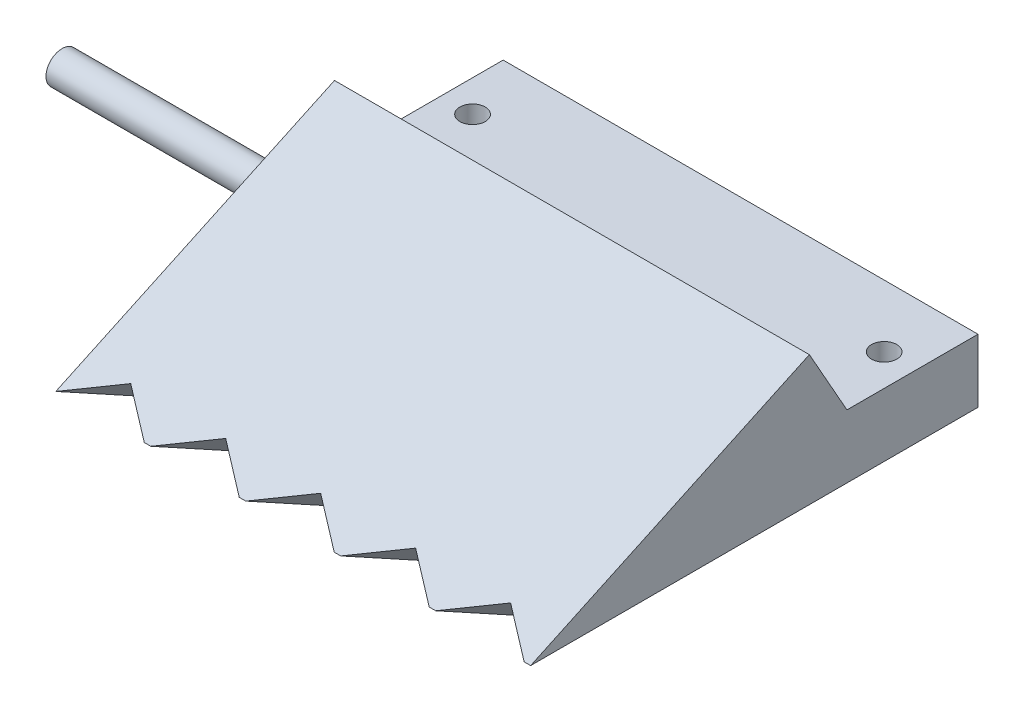
ISO-10303-21;
HEADER;
FILE_DESCRIPTION(('STEP AP214'),'2;1');
FILE_NAME('part.step','',(''),(''),'','','');
FILE_SCHEMA(('AUTOMOTIVE_DESIGN { 1 0 10303 214 1 1 1 1 }'));
ENDSEC;
DATA;
#1=APPLICATION_CONTEXT('core data for automotive mechanical design processes');
#2=APPLICATION_PROTOCOL_DEFINITION('international standard','automotive_design',2000,#1);
#3=PRODUCT_CONTEXT('',#1,'mechanical');
#4=PRODUCT('Part','Part','',(#3));
#5=PRODUCT_RELATED_PRODUCT_CATEGORY('part','',(#4));
#6=PRODUCT_DEFINITION_FORMATION('','',#4);
#7=PRODUCT_DEFINITION_CONTEXT('part definition',#1,'design');
#8=PRODUCT_DEFINITION('design','',#6,#7);
#9=PRODUCT_DEFINITION_SHAPE('','',#8);
#10=(LENGTH_UNIT() NAMED_UNIT(*) SI_UNIT(.MILLI.,.METRE.));
#11=(NAMED_UNIT(*) PLANE_ANGLE_UNIT() SI_UNIT($,.RADIAN.));
#12=(NAMED_UNIT(*) SI_UNIT($,.STERADIAN.) SOLID_ANGLE_UNIT());
#13=UNCERTAINTY_MEASURE_WITH_UNIT(LENGTH_MEASURE(1.E-05),#10,'distance_accuracy_value','');
#14=(GEOMETRIC_REPRESENTATION_CONTEXT(3) GLOBAL_UNCERTAINTY_ASSIGNED_CONTEXT((#13)) GLOBAL_UNIT_ASSIGNED_CONTEXT((#10,
#11,#12)) REPRESENTATION_CONTEXT('',''));
#15=CARTESIAN_POINT('',(0.,0.,0.));
#16=DIRECTION('',(0.,0.,1.));
#17=DIRECTION('',(1.,0.,0.));
#18=AXIS2_PLACEMENT_3D('',#15,#16,#17);
#19=CARTESIAN_POINT('',(75.,24.6994464564003,-8.57109619459907));
#20=DIRECTION('',(0.,-0.906307787036653,-0.422618261740694));
#21=DIRECTION('',(0.,0.422618261740694,-0.906307787036653));
#22=AXIS2_PLACEMENT_3D('',#19,#20,#21);
#23=PLANE('',#22);
#24=DIRECTION('',(0.,-0.422618261740694,0.906307787036653));
#25=VECTOR('',#24,1.);
#26=CARTESIAN_POINT('',(0.,24.6994464564003,-8.57109619459907));
#27=LINE('',#26,#25);
#28=CARTESIAN_POINT('',(0.,24.6994464564003,-8.57109619459907));
#29=VERTEX_POINT('',#28);
#30=CARTESIAN_POINT('',(0.,4.17318887122065,35.4476052489812));
#31=VERTEX_POINT('',#30);
#32=EDGE_CURVE('E220',#29,#31,#27,.T.);
#33=ORIENTED_EDGE('',*,*,#32,.T.);
#34=DIRECTION('',(-0.802159031205732,-0.25234978014748,0.541165849915346));
#35=VECTOR('',#34,1.);
#36=CARTESIAN_POINT('',(0.,4.17318887122065,35.4476052489812));
#37=LINE('',#36,#35);
#38=CARTESIAN_POINT('',(7.06585008190916,6.39602205686052,30.6807240992381));
#39=VERTEX_POINT('',#38);
#40=EDGE_CURVE('E152',#39,#31,#37,.T.);
#41=ORIENTED_EDGE('',*,*,#40,.F.);
#42=DIRECTION('',(-0.795744215045441,0.255951500653194,-0.548889764465591));
#43=VECTOR('',#42,1.);
#44=CARTESIAN_POINT('',(7.06585008190916,6.39602205686052,30.6807240992381));
#45=LINE('',#44,#43);
#46=CARTESIAN_POINT('',(13.9765602905617,4.17318887122065,35.4476052489812));
#47=VERTEX_POINT('',#46);
#48=EDGE_CURVE('E139',#47,#39,#45,.T.);
#49=ORIENTED_EDGE('',*,*,#48,.F.);
#50=DIRECTION('',(-1.,0.,0.));
#51=VECTOR('',#50,1.);
#52=CARTESIAN_POINT('',(75.,4.17318887122065,35.4476052489812));
#53=LINE('',#52,#51);
#54=CARTESIAN_POINT('',(15.,4.17318887122073,35.447605248981));
#55=VERTEX_POINT('',#54);
#56=EDGE_CURVE('E151',#55,#47,#53,.T.);
#57=ORIENTED_EDGE('',*,*,#56,.F.);
#58=DIRECTION('',(-0.802159031205732,-0.252349780147481,0.541165849915346));
#59=VECTOR('',#58,1.);
#60=CARTESIAN_POINT('',(15.,4.17318887122073,35.447605248981));
#61=LINE('',#60,#59);
#62=CARTESIAN_POINT('',(22.0658500819091,6.39602205686061,30.6807240992379));
#63=VERTEX_POINT('',#62);
#64=EDGE_CURVE('E381',#63,#55,#61,.T.);
#65=ORIENTED_EDGE('',*,*,#64,.F.);
#66=DIRECTION('',(-0.795744215045442,0.255951500653195,-0.548889764465591));
#67=VECTOR('',#66,1.);
#68=CARTESIAN_POINT('',(22.0658500819091,6.39602205686061,30.6807240992379));
#69=LINE('',#68,#67);
#70=CARTESIAN_POINT('',(28.9765602905617,4.17318887122073,35.447605248981));
#71=VERTEX_POINT('',#70);
#72=EDGE_CURVE('E204',#71,#63,#69,.T.);
#73=ORIENTED_EDGE('',*,*,#72,.F.);
#74=CARTESIAN_POINT('',(30.,4.17318887122082,35.4476052489808));
#75=VERTEX_POINT('',#74);
#76=EDGE_CURVE('E157',#75,#71,#53,.T.);
#77=ORIENTED_EDGE('',*,*,#76,.F.);
#78=DIRECTION('',(-0.802159031205732,-0.25234978014748,0.541165849915346));
#79=VECTOR('',#78,1.);
#80=CARTESIAN_POINT('',(30.,4.17318887122082,35.4476052489808));
#81=LINE('',#80,#79);
#82=CARTESIAN_POINT('',(37.0658500819091,6.3960220568607,30.6807240992377));
#83=VERTEX_POINT('',#82);
#84=EDGE_CURVE('E193',#83,#75,#81,.T.);
#85=ORIENTED_EDGE('',*,*,#84,.F.);
#86=DIRECTION('',(-0.795744215045442,0.255951500653194,-0.548889764465591));
#87=VECTOR('',#86,1.);
#88=CARTESIAN_POINT('',(37.0658500819091,6.3960220568607,30.6807240992377));
#89=LINE('',#88,#87);
#90=CARTESIAN_POINT('',(43.9765602905617,4.17318887122082,35.4476052489808));
#91=VERTEX_POINT('',#90);
#92=EDGE_CURVE('E191',#91,#83,#89,.T.);
#93=ORIENTED_EDGE('',*,*,#92,.F.);
#94=CARTESIAN_POINT('',(45.,4.17318887122091,35.4476052489806));
#95=VERTEX_POINT('',#94);
#96=EDGE_CURVE('E162',#95,#91,#53,.T.);
#97=ORIENTED_EDGE('',*,*,#96,.F.);
#98=DIRECTION('',(-0.802159031205732,-0.25234978014748,0.541165849915346));
#99=VECTOR('',#98,1.);
#100=CARTESIAN_POINT('',(45.,4.17318887122091,35.4476052489806));
#101=LINE('',#100,#99);
#102=CARTESIAN_POINT('',(52.0658500819091,6.39602205686078,30.6807240992375));
#103=VERTEX_POINT('',#102);
#104=EDGE_CURVE('E188',#103,#95,#101,.T.);
#105=ORIENTED_EDGE('',*,*,#104,.F.);
#106=DIRECTION('',(-0.795744215045442,0.255951500653194,-0.548889764465591));
#107=VECTOR('',#106,1.);
#108=CARTESIAN_POINT('',(52.0658500819091,6.39602205686078,30.6807240992375));
#109=LINE('',#108,#107);
#110=CARTESIAN_POINT('',(58.9765602905616,4.17318887122091,35.4476052489806));
#111=VERTEX_POINT('',#110);
#112=EDGE_CURVE('E205',#111,#103,#109,.T.);
#113=ORIENTED_EDGE('',*,*,#112,.F.);
#114=CARTESIAN_POINT('',(60.,4.173188871221,35.4476052489804));
#115=VERTEX_POINT('',#114);
#116=EDGE_CURVE('E169',#115,#111,#53,.T.);
#117=ORIENTED_EDGE('',*,*,#116,.F.);
#118=DIRECTION('',(-0.802159031205732,-0.25234978014748,0.541165849915346));
#119=VECTOR('',#118,1.);
#120=CARTESIAN_POINT('',(60.,4.173188871221,35.4476052489804));
#121=LINE('',#120,#119);
#122=CARTESIAN_POINT('',(67.0658500819091,6.39602205686087,30.6807240992373));
#123=VERTEX_POINT('',#122);
#124=EDGE_CURVE('E213',#123,#115,#121,.T.);
#125=ORIENTED_EDGE('',*,*,#124,.F.);
#126=DIRECTION('',(-0.795744215045442,0.255951500653194,-0.548889764465591));
#127=VECTOR('',#126,1.);
#128=CARTESIAN_POINT('',(67.0658500819091,6.39602205686087,30.6807240992373));
#129=LINE('',#128,#127);
#130=CARTESIAN_POINT('',(73.9765602905616,4.173188871221,35.4476052489804));
#131=VERTEX_POINT('',#130);
#132=EDGE_CURVE('E210',#131,#123,#129,.T.);
#133=ORIENTED_EDGE('',*,*,#132,.F.);
#134=CARTESIAN_POINT('',(75.,4.17318887122065,35.4476052489812));
#135=VERTEX_POINT('',#134);
#136=EDGE_CURVE('E160',#135,#131,#53,.T.);
#137=ORIENTED_EDGE('',*,*,#136,.F.);
#138=DIRECTION('',(0.,-0.422618261740694,0.906307787036653));
#139=VECTOR('',#138,1.);
#140=CARTESIAN_POINT('',(75.,24.6994464564003,-8.57109619459907));
#141=LINE('',#140,#139);
#142=CARTESIAN_POINT('',(75.,24.6994464564003,-8.57109619459907));
#143=VERTEX_POINT('',#142);
#144=EDGE_CURVE('E224',#143,#135,#141,.T.);
#145=ORIENTED_EDGE('',*,*,#144,.F.);
#146=DIRECTION('',(-1.,0.,0.));
#147=VECTOR('',#146,1.);
#148=CARTESIAN_POINT('',(75.,24.6994464564003,-8.57109619459907));
#149=LINE('',#148,#147);
#150=EDGE_CURVE('E236',#143,#29,#149,.T.);
#151=ORIENTED_EDGE('',*,*,#150,.T.);
#152=EDGE_LOOP('',(#33,#41,#49,#57,#65,#73,#77,#85,#93,#97,#105,#113,#117,#125,#133,#137,#145,#151));
#153=FACE_BOUND('',#152,.T.);
#154=ADVANCED_FACE('F34',(#153),#23,.F.);
#155=CARTESIAN_POINT('',(75.,4.17318887122065,35.4476052489812));
#156=DIRECTION('',(0.,1.,0.));
#157=DIRECTION('',(0.,0.,1.));
#158=AXIS2_PLACEMENT_3D('',#155,#156,#157);
#159=PLANE('',#158);
#160=CARTESIAN_POINT('',(69.9999989548679,4.17318887122065,-25.3862154796132));
#161=DIRECTION('',(0.,1.,0.));
#162=DIRECTION('',(0.,0.,1.));
#163=AXIS2_PLACEMENT_3D('',#160,#161,#162);
#164=CIRCLE('',#163,3.99999999999999);
#165=CARTESIAN_POINT('',(69.9999989548679,4.17318887122065,-21.3862154796132));
#166=VERTEX_POINT('',#165);
#167=EDGE_CURVE('E279',#166,#166,#164,.T.);
#168=ORIENTED_EDGE('',*,*,#167,.T.);
#169=EDGE_LOOP('',(#168));
#170=FACE_BOUND('',#169,.T.);
#171=CARTESIAN_POINT('',(5.,4.17318887122065,-25.3745592722076));
#172=DIRECTION('',(0.,1.,0.));
#173=DIRECTION('',(0.,0.,1.));
#174=AXIS2_PLACEMENT_3D('',#171,#172,#173);
#175=CIRCLE('',#174,3.99999999999999);
#176=CARTESIAN_POINT('',(5.,4.17318887122065,-21.3745592722076));
#177=VERTEX_POINT('',#176);
#178=EDGE_CURVE('E276',#177,#177,#175,.T.);
#179=ORIENTED_EDGE('',*,*,#178,.T.);
#180=EDGE_LOOP('',(#179));
#181=FACE_BOUND('',#180,.T.);
#182=DIRECTION('',(-0.765791701632656,0.,-0.643088695057347));
#183=VECTOR('',#182,1.);
#184=CARTESIAN_POINT('',(49.7629589494673,4.17318887122065,65.4999398006517));
#185=LINE('',#184,#183);
#186=CARTESIAN_POINT('',(7.06585008190916,4.17318887122065,29.6441999619731));
#187=VERTEX_POINT('',#186);
#188=EDGE_CURVE('E136',#47,#187,#185,.T.);
#189=ORIENTED_EDGE('',*,*,#188,.T.);
#190=DIRECTION('',(-0.772763043523777,0.,0.634694634106724));
#191=VECTOR('',#190,1.);
#192=CARTESIAN_POINT('',(44.7872041077098,4.17318887122065,-1.33753653805802));
#193=LINE('',#192,#191);
#194=EDGE_CURVE('E144',#187,#31,#193,.T.);
#195=ORIENTED_EDGE('',*,*,#194,.T.);
#196=DIRECTION('',(0.,0.,-1.));
#197=VECTOR('',#196,1.);
#198=CARTESIAN_POINT('',(0.,4.17318887122065,35.4476052489812));
#199=LINE('',#198,#197);
#200=CARTESIAN_POINT('',(0.,4.17318887122065,-35.2064814814815));
#201=VERTEX_POINT('',#200);
#202=EDGE_CURVE('E238',#31,#201,#199,.T.);
#203=ORIENTED_EDGE('',*,*,#202,.T.);
#204=DIRECTION('',(-1.,0.,0.));
#205=VECTOR('',#204,1.);
#206=CARTESIAN_POINT('',(75.,4.17318887122065,-35.2064814814815));
#207=LINE('',#206,#205);
#208=CARTESIAN_POINT('',(75.,4.17318887122065,-35.2064814814815));
#209=VERTEX_POINT('',#208);
#210=EDGE_CURVE('E158',#209,#201,#207,.T.);
#211=ORIENTED_EDGE('',*,*,#210,.F.);
#212=DIRECTION('',(0.,0.,-1.));
#213=VECTOR('',#212,1.);
#214=CARTESIAN_POINT('',(75.,4.17318887122065,35.4476052489812));
#215=LINE('',#214,#213);
#216=EDGE_CURVE('E227',#135,#209,#215,.T.);
#217=ORIENTED_EDGE('',*,*,#216,.F.);
#218=ORIENTED_EDGE('',*,*,#136,.T.);
#219=DIRECTION('',(-0.765791701632656,0.,-0.643088695057347));
#220=VECTOR('',#219,1.);
#221=CARTESIAN_POINT('',(74.5767431321014,4.17318887122065,35.9516206353298));
#222=LINE('',#221,#220);
#223=CARTESIAN_POINT('',(67.0658500819091,4.17318887122065,29.6441999619722));
#224=VERTEX_POINT('',#223);
#225=EDGE_CURVE('E168',#131,#224,#222,.T.);
#226=ORIENTED_EDGE('',*,*,#225,.T.);
#227=DIRECTION('',(-0.772763043523777,0.,0.634694634106724));
#228=VECTOR('',#227,1.);
#229=CARTESIAN_POINT('',(68.9574408215415,4.17318887122065,28.0905768915728));
#230=LINE('',#229,#228);
#231=EDGE_CURVE('E172',#224,#115,#230,.T.);
#232=ORIENTED_EDGE('',*,*,#231,.T.);
#233=ORIENTED_EDGE('',*,*,#116,.T.);
#234=DIRECTION('',(-0.765791701632656,0.,-0.643088695057347));
#235=VECTOR('',#234,1.);
#236=CARTESIAN_POINT('',(68.3732970864429,4.17318887122065,43.3387004266603));
#237=LINE('',#236,#235);
#238=CARTESIAN_POINT('',(52.0658500819091,4.17318887122065,29.6441999619725));
#239=VERTEX_POINT('',#238);
#240=EDGE_CURVE('E391',#111,#239,#237,.T.);
#241=ORIENTED_EDGE('',*,*,#240,.T.);
#242=DIRECTION('',(-0.772763043523777,0.,0.634694634106724));
#243=VECTOR('',#242,1.);
#244=CARTESIAN_POINT('',(62.9148816430836,4.17318887122065,20.7335485341651));
#245=LINE('',#244,#243);
#246=EDGE_CURVE('E184',#239,#95,#245,.T.);
#247=ORIENTED_EDGE('',*,*,#246,.T.);
#248=ORIENTED_EDGE('',*,*,#96,.T.);
#249=DIRECTION('',(-0.765791701632656,0.,-0.643088695057347));
#250=VECTOR('',#249,1.);
#251=CARTESIAN_POINT('',(62.1698510407844,4.17318887122065,50.7257802179907));
#252=LINE('',#251,#250);
#253=CARTESIAN_POINT('',(37.0658500819091,4.17318887122065,29.6441999619727));
#254=VERTEX_POINT('',#253);
#255=EDGE_CURVE('E182',#91,#254,#252,.T.);
#256=ORIENTED_EDGE('',*,*,#255,.T.);
#257=DIRECTION('',(-0.772763043523777,0.,0.634694634106724));
#258=VECTOR('',#257,1.);
#259=CARTESIAN_POINT('',(56.8723224646257,4.17318887122065,13.3765201767574));
#260=LINE('',#259,#258);
#261=EDGE_CURVE('E385',#254,#75,#260,.T.);
#262=ORIENTED_EDGE('',*,*,#261,.T.);
#263=ORIENTED_EDGE('',*,*,#76,.T.);
#264=DIRECTION('',(-0.765791701632656,0.,-0.643088695057347));
#265=VECTOR('',#264,1.);
#266=CARTESIAN_POINT('',(55.9664049951259,4.17318887122065,58.1128600093212));
#267=LINE('',#266,#265);
#268=CARTESIAN_POINT('',(22.0658500819091,4.17318887122065,29.6441999619729));
#269=VERTEX_POINT('',#268);
#270=EDGE_CURVE('E383',#71,#269,#267,.T.);
#271=ORIENTED_EDGE('',*,*,#270,.T.);
#272=DIRECTION('',(-0.772763043523778,0.,0.634694634106724));
#273=VECTOR('',#272,1.);
#274=CARTESIAN_POINT('',(50.8297632861678,4.17318887122065,6.01949181934968));
#275=LINE('',#274,#273);
#276=EDGE_CURVE('E145',#269,#55,#275,.T.);
#277=ORIENTED_EDGE('',*,*,#276,.T.);
#278=ORIENTED_EDGE('',*,*,#56,.T.);
#279=EDGE_LOOP('',(#189,#195,#203,#211,#217,#218,#226,#232,#233,#241,#247,#248,#256,#262,#263,
#271,#277,#278));
#280=FACE_BOUND('',#279,.T.);
#281=ADVANCED_FACE('F155',(#170,#181,#280),#159,.F.);
#282=CARTESIAN_POINT('',(75.,4.17318887122065,-35.2064814814815));
#283=DIRECTION('',(0.,0.,1.));
#284=DIRECTION('',(1.,0.,0.));
#285=AXIS2_PLACEMENT_3D('',#282,#283,#284);
#286=PLANE('',#285);
#287=DIRECTION('',(0.,1.,0.));
#288=VECTOR('',#287,1.);
#289=CARTESIAN_POINT('',(0.,4.17318887122065,-35.2064814814815));
#290=LINE('',#289,#288);
#291=CARTESIAN_POINT('',(0.,14.1731888712206,-35.2064814814815));
#292=VERTEX_POINT('',#291);
#293=EDGE_CURVE('E240',#201,#292,#290,.T.);
#294=ORIENTED_EDGE('',*,*,#293,.T.);
#295=DIRECTION('',(-1.,0.,0.));
#296=VECTOR('',#295,1.);
#297=CARTESIAN_POINT('',(75.,14.1731888712206,-35.2064814814815));
#298=LINE('',#297,#296);
#299=CARTESIAN_POINT('',(75.,14.1731888712206,-35.2064814814815));
#300=VERTEX_POINT('',#299);
#301=EDGE_CURVE('E164',#300,#292,#298,.T.);
#302=ORIENTED_EDGE('',*,*,#301,.F.);
#303=DIRECTION('',(0.,1.,0.));
#304=VECTOR('',#303,1.);
#305=CARTESIAN_POINT('',(75.,4.17318887122065,-35.2064814814815));
#306=LINE('',#305,#304);
#307=EDGE_CURVE('E230',#209,#300,#306,.T.);
#308=ORIENTED_EDGE('',*,*,#307,.F.);
#309=ORIENTED_EDGE('',*,*,#210,.T.);
#310=EDGE_LOOP('',(#294,#302,#308,#309));
#311=FACE_BOUND('',#310,.T.);
#312=ADVANCED_FACE('F274',(#311),#286,.F.);
#313=CARTESIAN_POINT('',(75.,14.1731888712206,-35.2064814814815));
#314=DIRECTION('',(0.,-1.,0.));
#315=DIRECTION('',(0.,0.,-1.));
#316=AXIS2_PLACEMENT_3D('',#313,#314,#315);
#317=PLANE('',#316);
#318=CARTESIAN_POINT('',(5.,14.1731888712206,-25.3745592722076));
#319=DIRECTION('',(0.,1.,0.));
#320=DIRECTION('',(0.,0.,1.));
#321=AXIS2_PLACEMENT_3D('',#318,#319,#320);
#322=CIRCLE('',#321,2.);
#323=CARTESIAN_POINT('',(5.,14.1731888712206,-23.3745592722076));
#324=VERTEX_POINT('',#323);
#325=EDGE_CURVE('E217',#324,#324,#322,.T.);
#326=ORIENTED_EDGE('',*,*,#325,.F.);
#327=EDGE_LOOP('',(#326));
#328=FACE_BOUND('',#327,.T.);
#329=CARTESIAN_POINT('',(69.9999989548679,14.1731888712206,-25.3862154796132));
#330=DIRECTION('',(0.,1.,0.));
#331=DIRECTION('',(0.,0.,1.));
#332=AXIS2_PLACEMENT_3D('',#329,#330,#331);
#333=CIRCLE('',#332,2.);
#334=CARTESIAN_POINT('',(69.9999989548679,14.1731888712206,-23.3862154796132));
#335=VERTEX_POINT('',#334);
#336=EDGE_CURVE('E221',#335,#335,#333,.T.);
#337=ORIENTED_EDGE('',*,*,#336,.F.);
#338=EDGE_LOOP('',(#337));
#339=FACE_BOUND('',#338,.T.);
#340=DIRECTION('',(0.,0.,1.));
#341=VECTOR('',#340,1.);
#342=CARTESIAN_POINT('',(0.,14.1731888712206,-35.2064814814815));
#343=LINE('',#342,#341);
#344=CARTESIAN_POINT('',(0.,14.1731888712206,-14.5119108644451));
#345=VERTEX_POINT('',#344);
#346=EDGE_CURVE('E242',#292,#345,#343,.T.);
#347=ORIENTED_EDGE('',*,*,#346,.T.);
#348=DIRECTION('',(-1.,0.,0.));
#349=VECTOR('',#348,1.);
#350=CARTESIAN_POINT('',(75.,14.1731888712206,-14.5119108644451));
#351=LINE('',#350,#349);
#352=CARTESIAN_POINT('',(75.,14.1731888712206,-14.5119108644451));
#353=VERTEX_POINT('',#352);
#354=EDGE_CURVE('E247',#353,#345,#351,.T.);
#355=ORIENTED_EDGE('',*,*,#354,.F.);
#356=DIRECTION('',(0.,0.,1.));
#357=VECTOR('',#356,1.);
#358=CARTESIAN_POINT('',(75.,14.1731888712206,-35.2064814814815));
#359=LINE('',#358,#357);
#360=EDGE_CURVE('E232',#300,#353,#359,.T.);
#361=ORIENTED_EDGE('',*,*,#360,.F.);
#362=ORIENTED_EDGE('',*,*,#301,.T.);
#363=EDGE_LOOP('',(#347,#355,#361,#362));
#364=FACE_BOUND('',#363,.T.);
#365=ADVANCED_FACE('F255',(#328,#339,#364),#317,.F.);
#366=CARTESIAN_POINT('',(75.,14.1731888712206,-14.5119108644451));
#367=DIRECTION('',(0.,-0.491504803469351,0.870874863666735));
#368=DIRECTION('',(0.,-0.870874863666736,-0.491504803469351));
#369=AXIS2_PLACEMENT_3D('',#366,#367,#368);
#370=PLANE('',#369);
#371=DIRECTION('',(0.,0.870874863666735,0.491504803469351));
#372=VECTOR('',#371,1.);
#373=CARTESIAN_POINT('',(0.,14.1731888712206,-14.5119108644451));
#374=LINE('',#373,#372);
#375=EDGE_CURVE('E228',#345,#29,#374,.T.);
#376=ORIENTED_EDGE('',*,*,#375,.T.);
#377=ORIENTED_EDGE('',*,*,#150,.F.);
#378=DIRECTION('',(0.,0.870874863666735,0.491504803469351));
#379=VECTOR('',#378,1.);
#380=CARTESIAN_POINT('',(75.,14.1731888712206,-14.5119108644451));
#381=LINE('',#380,#379);
#382=EDGE_CURVE('E234',#353,#143,#381,.T.);
#383=ORIENTED_EDGE('',*,*,#382,.F.);
#384=ORIENTED_EDGE('',*,*,#354,.T.);
#385=EDGE_LOOP('',(#376,#377,#383,#384));
#386=FACE_BOUND('',#385,.T.);
#387=ADVANCED_FACE('F267',(#386),#370,.F.);
#388=CARTESIAN_POINT('',(75.,0.,0.));
#389=DIRECTION('',(-1.,0.,0.));
#390=DIRECTION('',(0.,0.,1.));
#391=AXIS2_PLACEMENT_3D('',#388,#389,#390);
#392=PLANE('',#391);
#393=ORIENTED_EDGE('',*,*,#144,.T.);
#394=ORIENTED_EDGE('',*,*,#216,.T.);
#395=ORIENTED_EDGE('',*,*,#307,.T.);
#396=ORIENTED_EDGE('',*,*,#360,.T.);
#397=ORIENTED_EDGE('',*,*,#382,.T.);
#398=EDGE_LOOP('',(#393,#394,#395,#396,#397));
#399=FACE_BOUND('',#398,.T.);
#400=ADVANCED_FACE('F272',(#399),#392,.F.);
#401=CARTESIAN_POINT('',(0.,0.,0.));
#402=DIRECTION('',(-1.,0.,0.));
#403=DIRECTION('',(0.,0.,1.));
#404=AXIS2_PLACEMENT_3D('',#401,#402,#403);
#405=PLANE('',#404);
#406=CARTESIAN_POINT('',(0.,8.033515634858,-5.54758710562415));
#407=DIRECTION('',(-1.,0.,0.));
#408=DIRECTION('',(0.,0.,1.));
#409=AXIS2_PLACEMENT_3D('',#406,#407,#408);
#410=CIRCLE('',#409,2.54300844368567);
#411=CARTESIAN_POINT('',(0.,8.033515634858,-3.00457866193848));
#412=VERTEX_POINT('',#411);
#413=EDGE_CURVE('E374',#412,#412,#410,.T.);
#414=ORIENTED_EDGE('',*,*,#413,.F.);
#415=EDGE_LOOP('',(#414));
#416=FACE_BOUND('',#415,.T.);
#417=ORIENTED_EDGE('',*,*,#32,.F.);
#418=ORIENTED_EDGE('',*,*,#375,.F.);
#419=ORIENTED_EDGE('',*,*,#346,.F.);
#420=ORIENTED_EDGE('',*,*,#293,.F.);
#421=ORIENTED_EDGE('',*,*,#202,.F.);
#422=EDGE_LOOP('',(#417,#418,#419,#420,#421));
#423=FACE_BOUND('',#422,.T.);
#424=ADVANCED_FACE('F263',(#416,#423),#405,.T.);
#425=CARTESIAN_POINT('',(69.9999989548679,4.17318887122064,-25.3862154796132));
#426=DIRECTION('',(0.,1.,0.));
#427=DIRECTION('',(0.,0.,1.));
#428=AXIS2_PLACEMENT_3D('',#425,#426,#427);
#429=CYLINDRICAL_SURFACE('',#428,2.);
#430=CARTESIAN_POINT('',(69.9999989548679,6.17318887122064,-25.3862154796132));
#431=DIRECTION('',(0.,1.,0.));
#432=DIRECTION('',(0.,0.,1.));
#433=AXIS2_PLACEMENT_3D('',#430,#431,#432);
#434=CIRCLE('',#433,2.);
#435=CARTESIAN_POINT('',(69.9999989548679,6.17318887122064,-23.3862154796132));
#436=VERTEX_POINT('',#435);
#437=EDGE_CURVE('E42',#436,#436,#434,.F.);
#438=ORIENTED_EDGE('',*,*,#437,.T.);
#439=EDGE_LOOP('',(#438));
#440=FACE_BOUND('',#439,.T.);
#441=ORIENTED_EDGE('',*,*,#336,.T.);
#442=EDGE_LOOP('',(#441));
#443=FACE_BOUND('',#442,.T.);
#444=ADVANCED_FACE('F287',(#440,#443),#429,.F.);
#445=CARTESIAN_POINT('',(5.,4.17318887122064,-25.3745592722076));
#446=DIRECTION('',(0.,1.,0.));
#447=DIRECTION('',(0.,0.,1.));
#448=AXIS2_PLACEMENT_3D('',#445,#446,#447);
#449=CYLINDRICAL_SURFACE('',#448,2.);
#450=CARTESIAN_POINT('',(5.,6.17318887122064,-25.3745592722076));
#451=DIRECTION('',(0.,1.,0.));
#452=DIRECTION('',(0.,0.,1.));
#453=AXIS2_PLACEMENT_3D('',#450,#451,#452);
#454=CIRCLE('',#453,2.);
#455=CARTESIAN_POINT('',(5.,6.17318887122064,-23.3745592722076));
#456=VERTEX_POINT('',#455);
#457=EDGE_CURVE('E11',#456,#456,#454,.F.);
#458=ORIENTED_EDGE('',*,*,#457,.T.);
#459=EDGE_LOOP('',(#458));
#460=FACE_BOUND('',#459,.T.);
#461=ORIENTED_EDGE('',*,*,#325,.T.);
#462=EDGE_LOOP('',(#461));
#463=FACE_BOUND('',#462,.T.);
#464=ADVANCED_FACE('F329',(#460,#463),#449,.F.);
#465=CARTESIAN_POINT('',(60.,-4.88988899914553,31.2214226315735));
#466=DIRECTION('',(-0.597110449293161,0.339007055407765,-0.727002976423532));
#467=DIRECTION('',(-0.772763043523777,0.,0.634694634106724));
#468=AXIS2_PLACEMENT_3D('',#465,#466,#467);
#469=PLANE('',#468);
#470=DIRECTION('',(0.,0.906307787036653,0.422618261740694));
#471=VECTOR('',#470,1.);
#472=CARTESIAN_POINT('',(67.0658500819091,-2.66705581350565,26.4545414818304));
#473=LINE('',#472,#471);
#474=EDGE_CURVE('E208',#224,#123,#473,.T.);
#475=ORIENTED_EDGE('',*,*,#474,.T.);
#476=ORIENTED_EDGE('',*,*,#124,.T.);
#477=ORIENTED_EDGE('',*,*,#231,.F.);
#478=EDGE_LOOP('',(#475,#476,#477));
#479=FACE_BOUND('',#478,.T.);
#480=ADVANCED_FACE('F332',(#479),#469,.F.);
#481=CARTESIAN_POINT('',(67.0658500819091,-2.66705581350565,26.4545414818304));
#482=DIRECTION('',(0.605632846055854,0.336296036952717,-0.721189178585052));
#483=DIRECTION('',(-0.765791701632656,0.,-0.643088695057347));
#484=AXIS2_PLACEMENT_3D('',#481,#482,#483);
#485=PLANE('',#484);
#486=ORIENTED_EDGE('',*,*,#132,.T.);
#487=ORIENTED_EDGE('',*,*,#474,.F.);
#488=ORIENTED_EDGE('',*,*,#225,.F.);
#489=EDGE_LOOP('',(#486,#487,#488));
#490=FACE_BOUND('',#489,.T.);
#491=ADVANCED_FACE('F334',(#490),#485,.F.);
#492=CARTESIAN_POINT('',(45.,-4.88988899914562,31.2214226315737));
#493=DIRECTION('',(-0.597110449293161,0.339007055407765,-0.727002976423532));
#494=DIRECTION('',(-0.772763043523777,0.,0.634694634106724));
#495=AXIS2_PLACEMENT_3D('',#492,#493,#494);
#496=PLANE('',#495);
#497=DIRECTION('',(0.,0.906307787036653,0.422618261740694));
#498=VECTOR('',#497,1.);
#499=CARTESIAN_POINT('',(52.0658500819091,-2.66705581350574,26.4545414818306));
#500=LINE('',#499,#498);
#501=EDGE_CURVE('E195',#239,#103,#500,.T.);
#502=ORIENTED_EDGE('',*,*,#501,.T.);
#503=ORIENTED_EDGE('',*,*,#104,.T.);
#504=ORIENTED_EDGE('',*,*,#246,.F.);
#505=EDGE_LOOP('',(#502,#503,#504));
#506=FACE_BOUND('',#505,.T.);
#507=ADVANCED_FACE('F337',(#506),#496,.F.);
#508=CARTESIAN_POINT('',(52.0658500819091,-2.66705581350574,26.4545414818306));
#509=DIRECTION('',(0.605632846055854,0.336296036952717,-0.721189178585052));
#510=DIRECTION('',(-0.765791701632656,0.,-0.643088695057347));
#511=AXIS2_PLACEMENT_3D('',#508,#509,#510);
#512=PLANE('',#511);
#513=ORIENTED_EDGE('',*,*,#112,.T.);
#514=ORIENTED_EDGE('',*,*,#501,.F.);
#515=ORIENTED_EDGE('',*,*,#240,.F.);
#516=EDGE_LOOP('',(#513,#514,#515));
#517=FACE_BOUND('',#516,.T.);
#518=ADVANCED_FACE('F342',(#517),#512,.F.);
#519=CARTESIAN_POINT('',(30.,-4.88988899914571,31.2214226315739));
#520=DIRECTION('',(-0.597110449293161,0.339007055407765,-0.727002976423532));
#521=DIRECTION('',(-0.772763043523777,0.,0.634694634106724));
#522=AXIS2_PLACEMENT_3D('',#519,#520,#521);
#523=PLANE('',#522);
#524=DIRECTION('',(0.,0.906307787036653,0.422618261740694));
#525=VECTOR('',#524,1.);
#526=CARTESIAN_POINT('',(37.0658500819091,-2.66705581350583,26.4545414818308));
#527=LINE('',#526,#525);
#528=EDGE_CURVE('E197',#254,#83,#527,.T.);
#529=ORIENTED_EDGE('',*,*,#528,.T.);
#530=ORIENTED_EDGE('',*,*,#84,.T.);
#531=ORIENTED_EDGE('',*,*,#261,.F.);
#532=EDGE_LOOP('',(#529,#530,#531));
#533=FACE_BOUND('',#532,.T.);
#534=ADVANCED_FACE('F345',(#533),#523,.F.);
#535=CARTESIAN_POINT('',(37.0658500819091,-2.66705581350583,26.4545414818308));
#536=DIRECTION('',(0.605632846055854,0.336296036952717,-0.721189178585052));
#537=DIRECTION('',(-0.765791701632656,0.,-0.643088695057347));
#538=AXIS2_PLACEMENT_3D('',#535,#536,#537);
#539=PLANE('',#538);
#540=ORIENTED_EDGE('',*,*,#92,.T.);
#541=ORIENTED_EDGE('',*,*,#528,.F.);
#542=ORIENTED_EDGE('',*,*,#255,.F.);
#543=EDGE_LOOP('',(#540,#541,#542));
#544=FACE_BOUND('',#543,.T.);
#545=ADVANCED_FACE('F350',(#544),#539,.F.);
#546=CARTESIAN_POINT('',(15.,-4.8898889991458,31.221422631574));
#547=DIRECTION('',(-0.597110449293161,0.339007055407766,-0.727002976423533));
#548=DIRECTION('',(-0.772763043523778,0.,0.634694634106724));
#549=AXIS2_PLACEMENT_3D('',#546,#547,#548);
#550=PLANE('',#549);
#551=DIRECTION('',(0.,0.906307787036653,0.422618261740694));
#552=VECTOR('',#551,1.);
#553=CARTESIAN_POINT('',(22.0658500819091,-2.66705581350592,26.454541481831));
#554=LINE('',#553,#552);
#555=EDGE_CURVE('E57',#269,#63,#554,.T.);
#556=ORIENTED_EDGE('',*,*,#555,.T.);
#557=ORIENTED_EDGE('',*,*,#64,.T.);
#558=ORIENTED_EDGE('',*,*,#276,.F.);
#559=EDGE_LOOP('',(#556,#557,#558));
#560=FACE_BOUND('',#559,.T.);
#561=ADVANCED_FACE('F353',(#560),#550,.F.);
#562=CARTESIAN_POINT('',(22.0658500819091,-2.66705581350592,26.454541481831));
#563=DIRECTION('',(0.605632846055854,0.336296036952717,-0.721189178585052));
#564=DIRECTION('',(-0.765791701632656,0.,-0.643088695057347));
#565=AXIS2_PLACEMENT_3D('',#562,#563,#564);
#566=PLANE('',#565);
#567=ORIENTED_EDGE('',*,*,#72,.T.);
#568=ORIENTED_EDGE('',*,*,#555,.F.);
#569=ORIENTED_EDGE('',*,*,#270,.F.);
#570=EDGE_LOOP('',(#567,#568,#569));
#571=FACE_BOUND('',#570,.T.);
#572=ADVANCED_FACE('F357',(#571),#566,.F.);
#573=CARTESIAN_POINT('',(0.,-4.88988899914588,31.2214226315742));
#574=DIRECTION('',(-0.597110449293161,0.339007055407765,-0.727002976423532));
#575=DIRECTION('',(-0.772763043523777,0.,0.634694634106724));
#576=AXIS2_PLACEMENT_3D('',#573,#574,#575);
#577=PLANE('',#576);
#578=DIRECTION('',(0.,0.906307787036653,0.422618261740694));
#579=VECTOR('',#578,1.);
#580=CARTESIAN_POINT('',(7.06585008190916,-2.66705581350601,26.4545414818311));
#581=LINE('',#580,#579);
#582=EDGE_CURVE('E49',#187,#39,#581,.T.);
#583=ORIENTED_EDGE('',*,*,#582,.T.);
#584=ORIENTED_EDGE('',*,*,#40,.T.);
#585=ORIENTED_EDGE('',*,*,#194,.F.);
#586=EDGE_LOOP('',(#583,#584,#585));
#587=FACE_BOUND('',#586,.T.);
#588=ADVANCED_FACE('F360',(#587),#577,.F.);
#589=CARTESIAN_POINT('',(7.06585008190916,-2.66705581350601,26.4545414818311));
#590=DIRECTION('',(0.605632846055855,0.336296036952717,-0.721189178585052));
#591=DIRECTION('',(-0.765791701632656,0.,-0.643088695057347));
#592=AXIS2_PLACEMENT_3D('',#589,#590,#591);
#593=PLANE('',#592);
#594=ORIENTED_EDGE('',*,*,#48,.T.);
#595=ORIENTED_EDGE('',*,*,#582,.F.);
#596=ORIENTED_EDGE('',*,*,#188,.F.);
#597=EDGE_LOOP('',(#594,#595,#596));
#598=FACE_BOUND('',#597,.T.);
#599=ADVANCED_FACE('F138',(#598),#593,.F.);
#600=CARTESIAN_POINT('',(69.9999989548679,4.17318887122065,-25.3862154796132));
#601=DIRECTION('',(0.,-1.,0.));
#602=DIRECTION('',(0.,0.,-1.));
#603=AXIS2_PLACEMENT_3D('',#600,#601,#602);
#604=CONICAL_SURFACE('',#603,3.99999999999999,0.785398163397447);
#605=ORIENTED_EDGE('',*,*,#437,.F.);
#606=EDGE_LOOP('',(#605));
#607=FACE_BOUND('',#606,.T.);
#608=ORIENTED_EDGE('',*,*,#167,.F.);
#609=EDGE_LOOP('',(#608));
#610=FACE_BOUND('',#609,.T.);
#611=ADVANCED_FACE('F290',(#607,#610),#604,.F.);
#612=CARTESIAN_POINT('',(5.,4.17318887122065,-25.3745592722076));
#613=DIRECTION('',(0.,-1.,0.));
#614=DIRECTION('',(0.,0.,-1.));
#615=AXIS2_PLACEMENT_3D('',#612,#613,#614);
#616=CONICAL_SURFACE('',#615,3.99999999999999,0.785398163397447);
#617=ORIENTED_EDGE('',*,*,#457,.F.);
#618=EDGE_LOOP('',(#617));
#619=FACE_BOUND('',#618,.T.);
#620=ORIENTED_EDGE('',*,*,#178,.F.);
#621=EDGE_LOOP('',(#620));
#622=FACE_BOUND('',#621,.T.);
#623=ADVANCED_FACE('F36',(#619,#622),#616,.F.);
#624=CARTESIAN_POINT('',(-40.,8.033515634858,-5.54758710562415));
#625=DIRECTION('',(1.,0.,0.));
#626=DIRECTION('',(0.,0.,-1.));
#627=AXIS2_PLACEMENT_3D('',#624,#625,#626);
#628=CYLINDRICAL_SURFACE('',#627,2.54300844368567);
#629=CARTESIAN_POINT('',(-40.,8.033515634858,-5.54758710562415));
#630=DIRECTION('',(-1.,0.,0.));
#631=DIRECTION('',(0.,0.,1.));
#632=AXIS2_PLACEMENT_3D('',#629,#630,#631);
#633=CIRCLE('',#632,2.54300844368567);
#634=CARTESIAN_POINT('',(-40.,8.033515634858,-3.00457866193848));
#635=VERTEX_POINT('',#634);
#636=EDGE_CURVE('E214',#635,#635,#633,.T.);
#637=ORIENTED_EDGE('',*,*,#636,.F.);
#638=EDGE_LOOP('',(#637));
#639=FACE_BOUND('',#638,.T.);
#640=ORIENTED_EDGE('',*,*,#413,.T.);
#641=EDGE_LOOP('',(#640));
#642=FACE_BOUND('',#641,.T.);
#643=ADVANCED_FACE('F301',(#639,#642),#628,.T.);
#644=CARTESIAN_POINT('',(-40.,8.033515634858,-5.54758710562415));
#645=DIRECTION('',(-1.,0.,0.));
#646=DIRECTION('',(0.,0.,1.));
#647=AXIS2_PLACEMENT_3D('',#644,#645,#646);
#648=PLANE('',#647);
#649=ORIENTED_EDGE('',*,*,#636,.T.);
#650=EDGE_LOOP('',(#649));
#651=FACE_BOUND('',#650,.T.);
#652=ADVANCED_FACE('F306',(#651),#648,.T.);
#653=CLOSED_SHELL('',(#154,#281,#312,#365,#387,#400,#424,#444,#464,#480,#491,#507,#518,#534,
#545,#561,#572,#588,#599,#611,#623,#643,#652));
#654=MANIFOLD_SOLID_BREP('B2',#653);
#655=ADVANCED_BREP_SHAPE_REPRESENTATION('',(#18,#654),#14);
#656=SHAPE_DEFINITION_REPRESENTATION(#9,#655);
ENDSEC;
END-ISO-10303-21;
